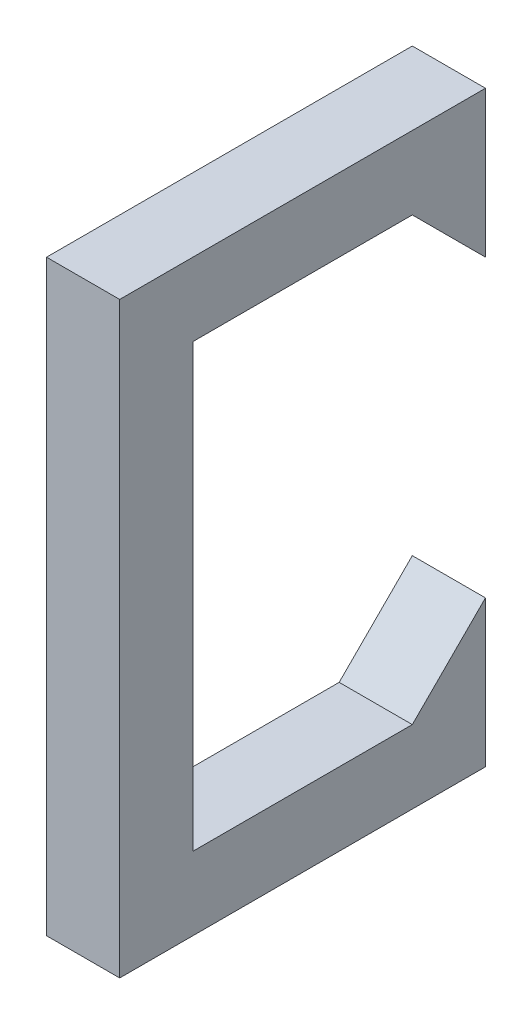
ISO-10303-21;
HEADER;
FILE_DESCRIPTION(('STEP AP214'),'2;1');
FILE_NAME('part.step','',(''),(''),'','','');
FILE_SCHEMA(('AUTOMOTIVE_DESIGN { 1 0 10303 214 1 1 1 1 }'));
ENDSEC;
DATA;
#1=APPLICATION_CONTEXT('core data for automotive mechanical design processes');
#2=APPLICATION_PROTOCOL_DEFINITION('international standard','automotive_design',2000,#1);
#3=PRODUCT_CONTEXT('',#1,'mechanical');
#4=PRODUCT('Part','Part','',(#3));
#5=PRODUCT_RELATED_PRODUCT_CATEGORY('part','',(#4));
#6=PRODUCT_DEFINITION_FORMATION('','',#4);
#7=PRODUCT_DEFINITION_CONTEXT('part definition',#1,'design');
#8=PRODUCT_DEFINITION('design','',#6,#7);
#9=PRODUCT_DEFINITION_SHAPE('','',#8);
#10=(LENGTH_UNIT() NAMED_UNIT(*) SI_UNIT(.MILLI.,.METRE.));
#11=(NAMED_UNIT(*) PLANE_ANGLE_UNIT() SI_UNIT($,.RADIAN.));
#12=(NAMED_UNIT(*) SI_UNIT($,.STERADIAN.) SOLID_ANGLE_UNIT());
#13=UNCERTAINTY_MEASURE_WITH_UNIT(LENGTH_MEASURE(1.E-05),#10,'distance_accuracy_value','');
#14=(GEOMETRIC_REPRESENTATION_CONTEXT(3) GLOBAL_UNCERTAINTY_ASSIGNED_CONTEXT((#13)) GLOBAL_UNIT_ASSIGNED_CONTEXT((#10,
#11,#12)) REPRESENTATION_CONTEXT('',''));
#15=CARTESIAN_POINT('',(0.,0.,0.));
#16=DIRECTION('',(0.,0.,1.));
#17=DIRECTION('',(1.,0.,0.));
#18=AXIS2_PLACEMENT_3D('',#15,#16,#17);
#19=CARTESIAN_POINT('',(0.,0.,0.));
#20=DIRECTION('',(0.,0.,1.));
#21=DIRECTION('',(1.,0.,0.));
#22=AXIS2_PLACEMENT_3D('',#19,#20,#21);
#23=PLANE('',#22);
#24=DIRECTION('',(1.,0.,0.));
#25=VECTOR('',#24,1.);
#26=CARTESIAN_POINT('',(0.,0.,0.));
#27=LINE('',#26,#25);
#28=CARTESIAN_POINT('',(0.,0.,0.));
#29=VERTEX_POINT('',#28);
#30=CARTESIAN_POINT('',(1.5,0.,0.));
#31=VERTEX_POINT('',#30);
#32=EDGE_CURVE('E124',#29,#31,#27,.T.);
#33=ORIENTED_EDGE('',*,*,#32,.F.);
#34=DIRECTION('',(0.,-1.,0.));
#35=VECTOR('',#34,1.);
#36=CARTESIAN_POINT('',(0.,0.,0.));
#37=LINE('',#36,#35);
#38=CARTESIAN_POINT('',(0.,9.05,0.));
#39=VERTEX_POINT('',#38);
#40=EDGE_CURVE('E178',#39,#29,#37,.T.);
#41=ORIENTED_EDGE('',*,*,#40,.F.);
#42=DIRECTION('',(1.,0.,0.));
#43=VECTOR('',#42,1.);
#44=CARTESIAN_POINT('',(0.,9.05,0.));
#45=LINE('',#44,#43);
#46=CARTESIAN_POINT('',(1.5,9.05,0.));
#47=VERTEX_POINT('',#46);
#48=EDGE_CURVE('E158',#39,#47,#45,.T.);
#49=ORIENTED_EDGE('',*,*,#48,.T.);
#50=DIRECTION('',(0.,-1.,0.));
#51=VECTOR('',#50,1.);
#52=CARTESIAN_POINT('',(1.5,0.,0.));
#53=LINE('',#52,#51);
#54=EDGE_CURVE('E173',#47,#31,#53,.T.);
#55=ORIENTED_EDGE('',*,*,#54,.T.);
#56=EDGE_LOOP('',(#33,#41,#49,#55));
#57=FACE_BOUND('',#56,.T.);
#58=ADVANCED_FACE('F36',(#57),#23,.F.);
#59=CARTESIAN_POINT('',(1.5,0.,1.5));
#60=DIRECTION('',(1.,0.,0.));
#61=DIRECTION('',(0.,0.,-1.));
#62=AXIS2_PLACEMENT_3D('',#59,#60,#61);
#63=PLANE('',#62);
#64=ORIENTED_EDGE('',*,*,#54,.F.);
#65=DIRECTION('',(0.,0.,1.));
#66=VECTOR('',#65,1.);
#67=CARTESIAN_POINT('',(1.5,9.05,-6.));
#68=LINE('',#67,#66);
#69=CARTESIAN_POINT('',(1.5,9.05,-4.5));
#70=VERTEX_POINT('',#69);
#71=EDGE_CURVE('E169',#70,#47,#68,.T.);
#72=ORIENTED_EDGE('',*,*,#71,.F.);
#73=DIRECTION('',(0.,-0.707106781186547,-0.707106781186548));
#74=VECTOR('',#73,1.);
#75=CARTESIAN_POINT('',(1.5,9.05,-4.5));
#76=LINE('',#75,#74);
#77=CARTESIAN_POINT('',(1.5,7.55,-6.));
#78=VERTEX_POINT('',#77);
#79=EDGE_CURVE('E141',#70,#78,#76,.T.);
#80=ORIENTED_EDGE('',*,*,#79,.T.);
#81=DIRECTION('',(0.,1.,0.));
#82=VECTOR('',#81,1.);
#83=CARTESIAN_POINT('',(1.5,0.,-6.));
#84=LINE('',#83,#82);
#85=CARTESIAN_POINT('',(1.5,10.55,-6.));
#86=VERTEX_POINT('',#85);
#87=EDGE_CURVE('E160',#78,#86,#84,.T.);
#88=ORIENTED_EDGE('',*,*,#87,.T.);
#89=DIRECTION('',(0.,0.,-1.));
#90=VECTOR('',#89,1.);
#91=CARTESIAN_POINT('',(1.5,10.55,1.5));
#92=LINE('',#91,#90);
#93=CARTESIAN_POINT('',(1.5,10.55,1.5));
#94=VERTEX_POINT('',#93);
#95=EDGE_CURVE('E11',#94,#86,#92,.T.);
#96=ORIENTED_EDGE('',*,*,#95,.F.);
#97=DIRECTION('',(0.,-1.,0.));
#98=VECTOR('',#97,1.);
#99=CARTESIAN_POINT('',(1.5,0.,1.5));
#100=LINE('',#99,#98);
#101=CARTESIAN_POINT('',(1.5,-1.5,1.5));
#102=VERTEX_POINT('',#101);
#103=EDGE_CURVE('E175',#94,#102,#100,.T.);
#104=ORIENTED_EDGE('',*,*,#103,.T.);
#105=DIRECTION('',(0.,0.,-1.));
#106=VECTOR('',#105,1.);
#107=CARTESIAN_POINT('',(1.5,-1.5,1.5));
#108=LINE('',#107,#106);
#109=CARTESIAN_POINT('',(1.5,-1.5,-6.));
#110=VERTEX_POINT('',#109);
#111=EDGE_CURVE('E119',#102,#110,#108,.T.);
#112=ORIENTED_EDGE('',*,*,#111,.T.);
#113=DIRECTION('',(0.,-1.,0.));
#114=VECTOR('',#113,1.);
#115=CARTESIAN_POINT('',(1.5,0.,-6.));
#116=LINE('',#115,#114);
#117=CARTESIAN_POINT('',(1.5,1.5,-6.));
#118=VERTEX_POINT('',#117);
#119=EDGE_CURVE('E111',#118,#110,#116,.T.);
#120=ORIENTED_EDGE('',*,*,#119,.F.);
#121=DIRECTION('',(0.,-0.707106781186548,0.707106781186547));
#122=VECTOR('',#121,1.);
#123=CARTESIAN_POINT('',(1.5,1.5,-6.));
#124=LINE('',#123,#122);
#125=CARTESIAN_POINT('',(1.5,0.,-4.5));
#126=VERTEX_POINT('',#125);
#127=EDGE_CURVE('E115',#118,#126,#124,.T.);
#128=ORIENTED_EDGE('',*,*,#127,.T.);
#129=DIRECTION('',(0.,0.,1.));
#130=VECTOR('',#129,1.);
#131=CARTESIAN_POINT('',(1.5,0.,-6.));
#132=LINE('',#131,#130);
#133=EDGE_CURVE('E153',#126,#31,#132,.T.);
#134=ORIENTED_EDGE('',*,*,#133,.T.);
#135=EDGE_LOOP('',(#64,#72,#80,#88,#96,#104,#112,#120,#128,#134));
#136=FACE_BOUND('',#135,.T.);
#137=ADVANCED_FACE('F38',(#136),#63,.T.);
#138=CARTESIAN_POINT('',(0.,10.55,1.5));
#139=DIRECTION('',(0.,1.,0.));
#140=DIRECTION('',(0.,0.,1.));
#141=AXIS2_PLACEMENT_3D('',#138,#139,#140);
#142=PLANE('',#141);
#143=ORIENTED_EDGE('',*,*,#95,.T.);
#144=DIRECTION('',(1.,0.,0.));
#145=VECTOR('',#144,1.);
#146=CARTESIAN_POINT('',(0.,10.55,-6.));
#147=LINE('',#146,#145);
#148=CARTESIAN_POINT('',(0.,10.55,-6.));
#149=VERTEX_POINT('',#148);
#150=EDGE_CURVE('E163',#149,#86,#147,.T.);
#151=ORIENTED_EDGE('',*,*,#150,.F.);
#152=DIRECTION('',(0.,0.,-1.));
#153=VECTOR('',#152,1.);
#154=CARTESIAN_POINT('',(0.,10.55,1.5));
#155=LINE('',#154,#153);
#156=CARTESIAN_POINT('',(0.,10.55,1.5));
#157=VERTEX_POINT('',#156);
#158=EDGE_CURVE('E44',#157,#149,#155,.T.);
#159=ORIENTED_EDGE('',*,*,#158,.F.);
#160=DIRECTION('',(1.,0.,0.));
#161=VECTOR('',#160,1.);
#162=CARTESIAN_POINT('',(0.,10.55,1.5));
#163=LINE('',#162,#161);
#164=EDGE_CURVE('E177',#157,#94,#163,.T.);
#165=ORIENTED_EDGE('',*,*,#164,.T.);
#166=EDGE_LOOP('',(#143,#151,#159,#165));
#167=FACE_BOUND('',#166,.T.);
#168=ADVANCED_FACE('F202',(#167),#142,.T.);
#169=CARTESIAN_POINT('',(0.,0.,1.5));
#170=DIRECTION('',(1.,0.,0.));
#171=DIRECTION('',(0.,1.,0.));
#172=AXIS2_PLACEMENT_3D('',#169,#170,#171);
#173=PLANE('',#172);
#174=ORIENTED_EDGE('',*,*,#158,.T.);
#175=DIRECTION('',(0.,1.,0.));
#176=VECTOR('',#175,1.);
#177=CARTESIAN_POINT('',(0.,0.,-6.));
#178=LINE('',#177,#176);
#179=CARTESIAN_POINT('',(0.,7.55,-6.));
#180=VERTEX_POINT('',#179);
#181=EDGE_CURVE('E166',#180,#149,#178,.T.);
#182=ORIENTED_EDGE('',*,*,#181,.F.);
#183=DIRECTION('',(0.,0.707106781186547,0.707106781186548));
#184=VECTOR('',#183,1.);
#185=CARTESIAN_POINT('',(0.,9.05,-4.5));
#186=LINE('',#185,#184);
#187=CARTESIAN_POINT('',(0.,9.05,-4.5));
#188=VERTEX_POINT('',#187);
#189=EDGE_CURVE('E142',#180,#188,#186,.T.);
#190=ORIENTED_EDGE('',*,*,#189,.T.);
#191=DIRECTION('',(0.,0.,1.));
#192=VECTOR('',#191,1.);
#193=CARTESIAN_POINT('',(0.,9.05,-6.));
#194=LINE('',#193,#192);
#195=EDGE_CURVE('E56',#188,#39,#194,.T.);
#196=ORIENTED_EDGE('',*,*,#195,.T.);
#197=ORIENTED_EDGE('',*,*,#40,.T.);
#198=DIRECTION('',(0.,0.,1.));
#199=VECTOR('',#198,1.);
#200=CARTESIAN_POINT('',(0.,0.,-6.));
#201=LINE('',#200,#199);
#202=CARTESIAN_POINT('',(0.,0.,-4.5));
#203=VERTEX_POINT('',#202);
#204=EDGE_CURVE('E156',#203,#29,#201,.T.);
#205=ORIENTED_EDGE('',*,*,#204,.F.);
#206=DIRECTION('',(0.,0.707106781186548,-0.707106781186547));
#207=VECTOR('',#206,1.);
#208=CARTESIAN_POINT('',(0.,1.5,-6.));
#209=LINE('',#208,#207);
#210=CARTESIAN_POINT('',(0.,1.5,-6.));
#211=VERTEX_POINT('',#210);
#212=EDGE_CURVE('E138',#203,#211,#209,.T.);
#213=ORIENTED_EDGE('',*,*,#212,.T.);
#214=DIRECTION('',(0.,-1.,0.));
#215=VECTOR('',#214,1.);
#216=CARTESIAN_POINT('',(0.,0.,-6.));
#217=LINE('',#216,#215);
#218=CARTESIAN_POINT('',(0.,-1.5,-6.));
#219=VERTEX_POINT('',#218);
#220=EDGE_CURVE('E123',#211,#219,#217,.T.);
#221=ORIENTED_EDGE('',*,*,#220,.T.);
#222=DIRECTION('',(0.,0.,-1.));
#223=VECTOR('',#222,1.);
#224=CARTESIAN_POINT('',(0.,-1.5,1.5));
#225=LINE('',#224,#223);
#226=CARTESIAN_POINT('',(0.,-1.5,1.5));
#227=VERTEX_POINT('',#226);
#228=EDGE_CURVE('E190',#227,#219,#225,.T.);
#229=ORIENTED_EDGE('',*,*,#228,.F.);
#230=DIRECTION('',(0.,-1.,0.));
#231=VECTOR('',#230,1.);
#232=CARTESIAN_POINT('',(0.,0.,1.5));
#233=LINE('',#232,#231);
#234=EDGE_CURVE('E181',#157,#227,#233,.T.);
#235=ORIENTED_EDGE('',*,*,#234,.F.);
#236=EDGE_LOOP('',(#174,#182,#190,#196,#197,#205,#213,#221,#229,#235));
#237=FACE_BOUND('',#236,.T.);
#238=ADVANCED_FACE('F193',(#237),#173,.F.);
#239=CARTESIAN_POINT('',(0.,-1.5,1.5));
#240=DIRECTION('',(0.,1.,0.));
#241=DIRECTION('',(0.,0.,1.));
#242=AXIS2_PLACEMENT_3D('',#239,#240,#241);
#243=PLANE('',#242);
#244=ORIENTED_EDGE('',*,*,#228,.T.);
#245=DIRECTION('',(1.,0.,0.));
#246=VECTOR('',#245,1.);
#247=CARTESIAN_POINT('',(0.,-1.5,-6.));
#248=LINE('',#247,#246);
#249=EDGE_CURVE('E151',#219,#110,#248,.T.);
#250=ORIENTED_EDGE('',*,*,#249,.T.);
#251=ORIENTED_EDGE('',*,*,#111,.F.);
#252=DIRECTION('',(1.,0.,0.));
#253=VECTOR('',#252,1.);
#254=CARTESIAN_POINT('',(0.,-1.5,1.5));
#255=LINE('',#254,#253);
#256=EDGE_CURVE('E183',#227,#102,#255,.T.);
#257=ORIENTED_EDGE('',*,*,#256,.F.);
#258=EDGE_LOOP('',(#244,#250,#251,#257));
#259=FACE_BOUND('',#258,.T.);
#260=ADVANCED_FACE('F208',(#259),#243,.F.);
#261=CARTESIAN_POINT('',(0.,0.,1.5));
#262=DIRECTION('',(0.,0.,1.));
#263=DIRECTION('',(1.,0.,0.));
#264=AXIS2_PLACEMENT_3D('',#261,#262,#263);
#265=PLANE('',#264);
#266=ORIENTED_EDGE('',*,*,#103,.F.);
#267=ORIENTED_EDGE('',*,*,#164,.F.);
#268=ORIENTED_EDGE('',*,*,#234,.T.);
#269=ORIENTED_EDGE('',*,*,#256,.T.);
#270=EDGE_LOOP('',(#266,#267,#268,#269));
#271=FACE_BOUND('',#270,.T.);
#272=ADVANCED_FACE('F205',(#271),#265,.T.);
#273=CARTESIAN_POINT('',(0.,9.05,-6.));
#274=DIRECTION('',(0.,-1.,0.));
#275=DIRECTION('',(0.,0.,-1.));
#276=AXIS2_PLACEMENT_3D('',#273,#274,#275);
#277=PLANE('',#276);
#278=DIRECTION('',(1.,0.,0.));
#279=VECTOR('',#278,1.);
#280=CARTESIAN_POINT('',(-2.12132034355964,9.05,-4.5));
#281=LINE('',#280,#279);
#282=EDGE_CURVE('E51',#188,#70,#281,.T.);
#283=ORIENTED_EDGE('',*,*,#282,.T.);
#284=ORIENTED_EDGE('',*,*,#71,.T.);
#285=ORIENTED_EDGE('',*,*,#48,.F.);
#286=ORIENTED_EDGE('',*,*,#195,.F.);
#287=EDGE_LOOP('',(#283,#284,#285,#286));
#288=FACE_BOUND('',#287,.T.);
#289=ADVANCED_FACE('F215',(#288),#277,.T.);
#290=CARTESIAN_POINT('',(0.,0.,-6.));
#291=DIRECTION('',(0.,0.,1.));
#292=DIRECTION('',(1.,0.,0.));
#293=AXIS2_PLACEMENT_3D('',#290,#291,#292);
#294=PLANE('',#293);
#295=ORIENTED_EDGE('',*,*,#87,.F.);
#296=DIRECTION('',(1.,0.,0.));
#297=VECTOR('',#296,1.);
#298=CARTESIAN_POINT('',(-2.12132034355964,7.55,-6.));
#299=LINE('',#298,#297);
#300=EDGE_CURVE('E144',#180,#78,#299,.T.);
#301=ORIENTED_EDGE('',*,*,#300,.F.);
#302=ORIENTED_EDGE('',*,*,#181,.T.);
#303=ORIENTED_EDGE('',*,*,#150,.T.);
#304=EDGE_LOOP('',(#295,#301,#302,#303));
#305=FACE_BOUND('',#304,.T.);
#306=ADVANCED_FACE('F201',(#305),#294,.F.);
#307=CARTESIAN_POINT('',(0.,0.,-6.));
#308=DIRECTION('',(0.,-1.,0.));
#309=DIRECTION('',(0.,0.,-1.));
#310=AXIS2_PLACEMENT_3D('',#307,#308,#309);
#311=PLANE('',#310);
#312=ORIENTED_EDGE('',*,*,#133,.F.);
#313=DIRECTION('',(1.,0.,0.));
#314=VECTOR('',#313,1.);
#315=CARTESIAN_POINT('',(-2.12132034355964,0.,-4.5));
#316=LINE('',#315,#314);
#317=EDGE_CURVE('E132',#203,#126,#316,.T.);
#318=ORIENTED_EDGE('',*,*,#317,.F.);
#319=ORIENTED_EDGE('',*,*,#204,.T.);
#320=ORIENTED_EDGE('',*,*,#32,.T.);
#321=EDGE_LOOP('',(#312,#318,#319,#320));
#322=FACE_BOUND('',#321,.T.);
#323=ADVANCED_FACE('F211',(#322),#311,.F.);
#324=CARTESIAN_POINT('',(0.,0.,-6.));
#325=DIRECTION('',(0.,0.,1.));
#326=DIRECTION('',(1.,0.,0.));
#327=AXIS2_PLACEMENT_3D('',#324,#325,#326);
#328=PLANE('',#327);
#329=ORIENTED_EDGE('',*,*,#119,.T.);
#330=ORIENTED_EDGE('',*,*,#249,.F.);
#331=ORIENTED_EDGE('',*,*,#220,.F.);
#332=DIRECTION('',(1.,0.,0.));
#333=VECTOR('',#332,1.);
#334=CARTESIAN_POINT('',(-2.12132034355964,1.5,-6.));
#335=LINE('',#334,#333);
#336=EDGE_CURVE('E127',#211,#118,#335,.T.);
#337=ORIENTED_EDGE('',*,*,#336,.T.);
#338=EDGE_LOOP('',(#329,#330,#331,#337));
#339=FACE_BOUND('',#338,.T.);
#340=ADVANCED_FACE('F128',(#339),#328,.F.);
#341=CARTESIAN_POINT('',(-2.12132034355964,9.05,-4.5));
#342=DIRECTION('',(0.,-0.707106781186548,0.707106781186547));
#343=DIRECTION('',(0.,-0.707106781186547,-0.707106781186548));
#344=AXIS2_PLACEMENT_3D('',#341,#342,#343);
#345=PLANE('',#344);
#346=ORIENTED_EDGE('',*,*,#189,.F.);
#347=ORIENTED_EDGE('',*,*,#300,.T.);
#348=ORIENTED_EDGE('',*,*,#79,.F.);
#349=ORIENTED_EDGE('',*,*,#282,.F.);
#350=EDGE_LOOP('',(#346,#347,#348,#349));
#351=FACE_BOUND('',#350,.T.);
#352=ADVANCED_FACE('F218',(#351),#345,.T.);
#353=CARTESIAN_POINT('',(-2.12132034355964,1.5,-6.));
#354=DIRECTION('',(0.,0.707106781186547,0.707106781186548));
#355=DIRECTION('',(0.,-0.707106781186548,0.707106781186547));
#356=AXIS2_PLACEMENT_3D('',#353,#354,#355);
#357=PLANE('',#356);
#358=ORIENTED_EDGE('',*,*,#212,.F.);
#359=ORIENTED_EDGE('',*,*,#317,.T.);
#360=ORIENTED_EDGE('',*,*,#127,.F.);
#361=ORIENTED_EDGE('',*,*,#336,.F.);
#362=EDGE_LOOP('',(#358,#359,#360,#361));
#363=FACE_BOUND('',#362,.T.);
#364=ADVANCED_FACE('F134',(#363),#357,.T.);
#365=CLOSED_SHELL('',(#58,#137,#168,#238,#260,#272,#289,#306,#323,#340,#352,#364));
#366=MANIFOLD_SOLID_BREP('B2',#365);
#367=ADVANCED_BREP_SHAPE_REPRESENTATION('',(#18,#366),#14);
#368=SHAPE_DEFINITION_REPRESENTATION(#9,#367);
ENDSEC;
END-ISO-10303-21;
